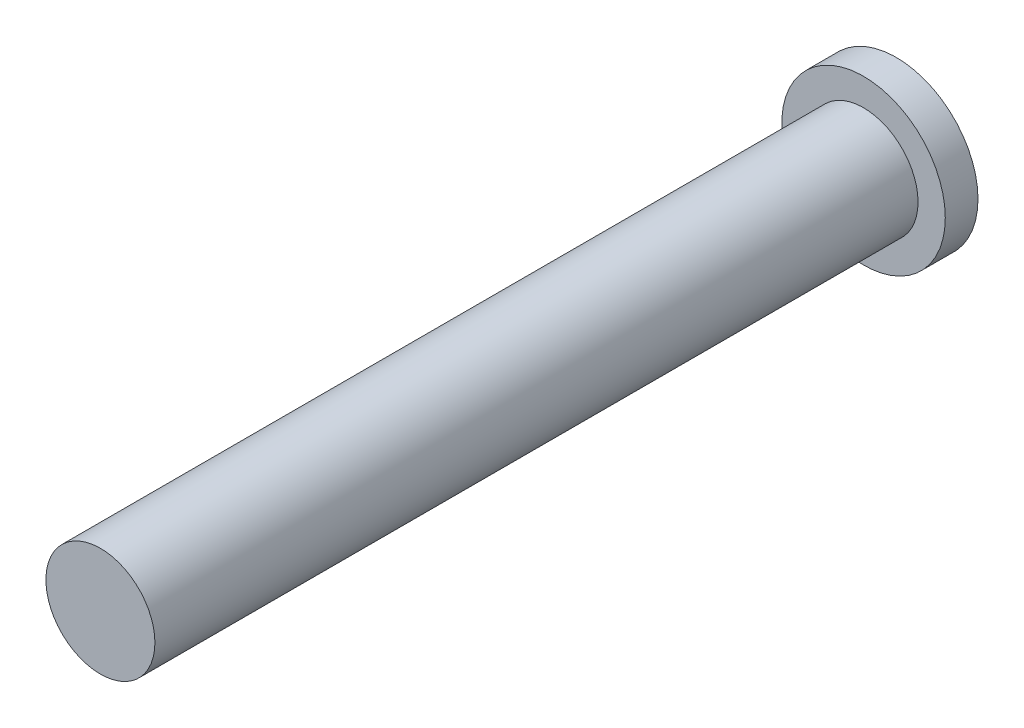
ISO-10303-21;
HEADER;
FILE_DESCRIPTION(('STEP AP214'),'2;1');
FILE_NAME('part.step','',(''),(''),'','','');
FILE_SCHEMA(('AUTOMOTIVE_DESIGN { 1 0 10303 214 1 1 1 1 }'));
ENDSEC;
DATA;
#1=APPLICATION_CONTEXT('core data for automotive mechanical design processes');
#2=APPLICATION_PROTOCOL_DEFINITION('international standard','automotive_design',2000,#1);
#3=PRODUCT_CONTEXT('',#1,'mechanical');
#4=PRODUCT('Part','Part','',(#3));
#5=PRODUCT_RELATED_PRODUCT_CATEGORY('part','',(#4));
#6=PRODUCT_DEFINITION_FORMATION('','',#4);
#7=PRODUCT_DEFINITION_CONTEXT('part definition',#1,'design');
#8=PRODUCT_DEFINITION('design','',#6,#7);
#9=PRODUCT_DEFINITION_SHAPE('','',#8);
#10=(LENGTH_UNIT() NAMED_UNIT(*) SI_UNIT(.MILLI.,.METRE.));
#11=(NAMED_UNIT(*) PLANE_ANGLE_UNIT() SI_UNIT($,.RADIAN.));
#12=(NAMED_UNIT(*) SI_UNIT($,.STERADIAN.) SOLID_ANGLE_UNIT());
#13=UNCERTAINTY_MEASURE_WITH_UNIT(LENGTH_MEASURE(1.E-05),#10,'distance_accuracy_value','');
#14=(GEOMETRIC_REPRESENTATION_CONTEXT(3) GLOBAL_UNCERTAINTY_ASSIGNED_CONTEXT((#13)) GLOBAL_UNIT_ASSIGNED_CONTEXT((#10,
#11,#12)) REPRESENTATION_CONTEXT('',''));
#15=CARTESIAN_POINT('',(0.,0.,0.));
#16=DIRECTION('',(0.,0.,1.));
#17=DIRECTION('',(1.,0.,0.));
#18=AXIS2_PLACEMENT_3D('',#15,#16,#17);
#19=CARTESIAN_POINT('',(0.,0.,3.));
#20=DIRECTION('',(0.,0.,-1.));
#21=DIRECTION('',(-1.,0.,0.));
#22=AXIS2_PLACEMENT_3D('',#19,#20,#21);
#23=CYLINDRICAL_SURFACE('',#22,7.5);
#24=CARTESIAN_POINT('',(0.,0.,3.));
#25=DIRECTION('',(0.,0.,1.));
#26=DIRECTION('',(1.,0.,0.));
#27=AXIS2_PLACEMENT_3D('',#24,#25,#26);
#28=CIRCLE('',#27,7.5);
#29=CARTESIAN_POINT('',(7.5,0.,3.));
#30=VERTEX_POINT('',#29);
#31=EDGE_CURVE('E42',#30,#30,#28,.T.);
#32=ORIENTED_EDGE('',*,*,#31,.F.);
#33=EDGE_LOOP('',(#32));
#34=FACE_BOUND('',#33,.T.);
#35=CARTESIAN_POINT('',(0.,0.,0.));
#36=DIRECTION('',(0.,0.,1.));
#37=DIRECTION('',(1.,0.,0.));
#38=AXIS2_PLACEMENT_3D('',#35,#36,#37);
#39=CIRCLE('',#38,7.5);
#40=CARTESIAN_POINT('',(7.5,0.,0.));
#41=VERTEX_POINT('',#40);
#42=EDGE_CURVE('E38',#41,#41,#39,.T.);
#43=ORIENTED_EDGE('',*,*,#42,.T.);
#44=EDGE_LOOP('',(#43));
#45=FACE_BOUND('',#44,.T.);
#46=ADVANCED_FACE('F35',(#34,#45),#23,.T.);
#47=CARTESIAN_POINT('',(0.,0.,3.));
#48=DIRECTION('',(0.,0.,1.));
#49=DIRECTION('',(1.,0.,0.));
#50=AXIS2_PLACEMENT_3D('',#47,#48,#49);
#51=PLANE('',#50);
#52=CARTESIAN_POINT('',(0.,0.,3.));
#53=DIRECTION('',(0.,0.,1.));
#54=DIRECTION('',(1.,0.,0.));
#55=AXIS2_PLACEMENT_3D('',#52,#53,#54);
#56=CIRCLE('',#55,5.);
#57=CARTESIAN_POINT('',(5.,0.,3.));
#58=VERTEX_POINT('',#57);
#59=EDGE_CURVE('E10',#58,#58,#56,.T.);
#60=ORIENTED_EDGE('',*,*,#59,.F.);
#61=EDGE_LOOP('',(#60));
#62=FACE_BOUND('',#61,.T.);
#63=ORIENTED_EDGE('',*,*,#31,.T.);
#64=EDGE_LOOP('',(#63));
#65=FACE_BOUND('',#64,.T.);
#66=ADVANCED_FACE('F59',(#62,#65),#51,.T.);
#67=CARTESIAN_POINT('',(0.,0.,0.));
#68=DIRECTION('',(0.,0.,1.));
#69=DIRECTION('',(1.,0.,0.));
#70=AXIS2_PLACEMENT_3D('',#67,#68,#69);
#71=PLANE('',#70);
#72=ORIENTED_EDGE('',*,*,#42,.F.);
#73=EDGE_LOOP('',(#72));
#74=FACE_BOUND('',#73,.T.);
#75=ADVANCED_FACE('F56',(#74),#71,.F.);
#76=CARTESIAN_POINT('',(0.,0.,73.));
#77=DIRECTION('',(0.,0.,-1.));
#78=DIRECTION('',(-1.,0.,0.));
#79=AXIS2_PLACEMENT_3D('',#76,#77,#78);
#80=CYLINDRICAL_SURFACE('',#79,5.);
#81=CARTESIAN_POINT('',(0.,0.,73.));
#82=DIRECTION('',(0.,0.,1.));
#83=DIRECTION('',(1.,0.,0.));
#84=AXIS2_PLACEMENT_3D('',#81,#82,#83);
#85=CIRCLE('',#84,5.);
#86=CARTESIAN_POINT('',(5.,0.,73.));
#87=VERTEX_POINT('',#86);
#88=EDGE_CURVE('E48',#87,#87,#85,.T.);
#89=ORIENTED_EDGE('',*,*,#88,.F.);
#90=EDGE_LOOP('',(#89));
#91=FACE_BOUND('',#90,.T.);
#92=ORIENTED_EDGE('',*,*,#59,.T.);
#93=EDGE_LOOP('',(#92));
#94=FACE_BOUND('',#93,.T.);
#95=ADVANCED_FACE('F58',(#91,#94),#80,.T.);
#96=CARTESIAN_POINT('',(0.,0.,73.));
#97=DIRECTION('',(0.,0.,1.));
#98=DIRECTION('',(1.,0.,0.));
#99=AXIS2_PLACEMENT_3D('',#96,#97,#98);
#100=PLANE('',#99);
#101=ORIENTED_EDGE('',*,*,#88,.T.);
#102=EDGE_LOOP('',(#101));
#103=FACE_BOUND('',#102,.T.);
#104=ADVANCED_FACE('F64',(#103),#100,.T.);
#105=CLOSED_SHELL('',(#46,#66,#75,#95,#104));
#106=MANIFOLD_SOLID_BREP('B2',#105);
#107=ADVANCED_BREP_SHAPE_REPRESENTATION('',(#18,#106),#14);
#108=SHAPE_DEFINITION_REPRESENTATION(#9,#107);
ENDSEC;
END-ISO-10303-21;
